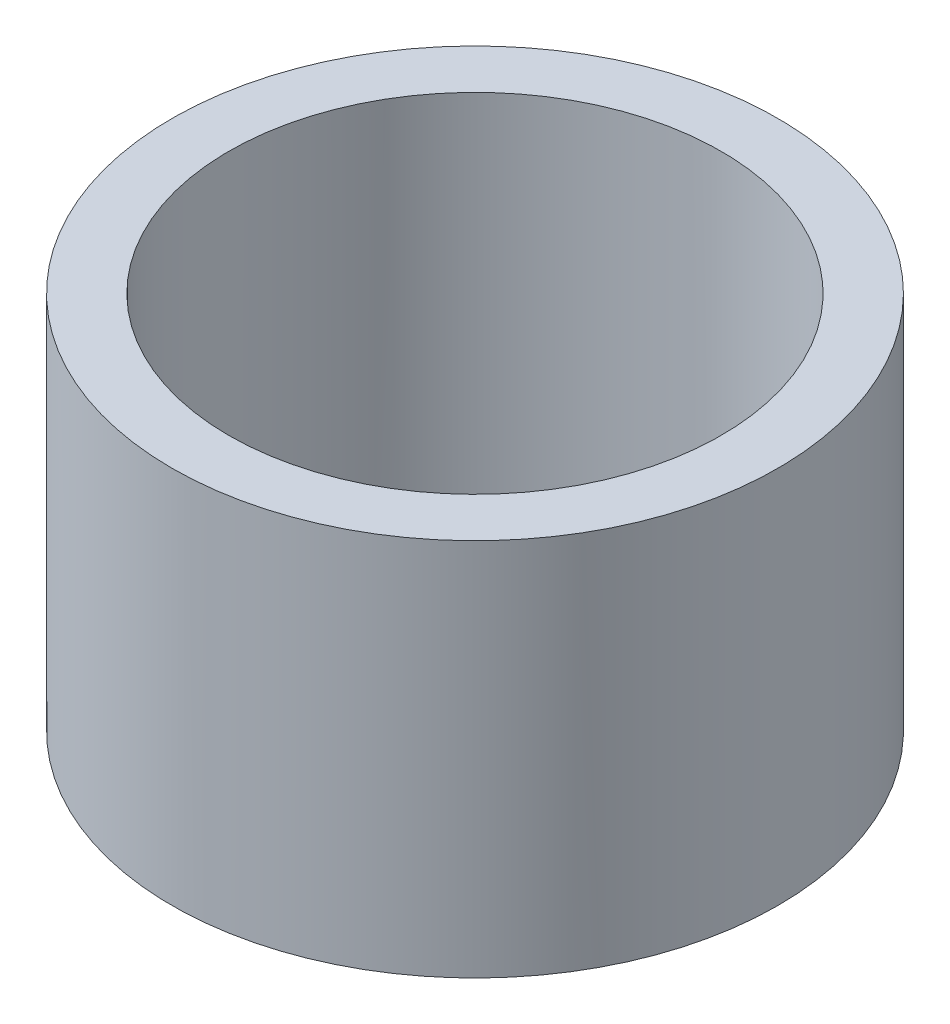
ISO-10303-21;
HEADER;
FILE_DESCRIPTION(('STEP AP214'),'2;1');
FILE_NAME('part.step','',(''),(''),'','','');
FILE_SCHEMA(('AUTOMOTIVE_DESIGN { 1 0 10303 214 1 1 1 1 }'));
ENDSEC;
DATA;
#1=APPLICATION_CONTEXT('core data for automotive mechanical design processes');
#2=APPLICATION_PROTOCOL_DEFINITION('international standard','automotive_design',2000,#1);
#3=PRODUCT_CONTEXT('',#1,'mechanical');
#4=PRODUCT('Part','Part','',(#3));
#5=PRODUCT_RELATED_PRODUCT_CATEGORY('part','',(#4));
#6=PRODUCT_DEFINITION_FORMATION('','',#4);
#7=PRODUCT_DEFINITION_CONTEXT('part definition',#1,'design');
#8=PRODUCT_DEFINITION('design','',#6,#7);
#9=PRODUCT_DEFINITION_SHAPE('','',#8);
#10=(LENGTH_UNIT() NAMED_UNIT(*) SI_UNIT(.MILLI.,.METRE.));
#11=(NAMED_UNIT(*) PLANE_ANGLE_UNIT() SI_UNIT($,.RADIAN.));
#12=(NAMED_UNIT(*) SI_UNIT($,.STERADIAN.) SOLID_ANGLE_UNIT());
#13=UNCERTAINTY_MEASURE_WITH_UNIT(LENGTH_MEASURE(1.E-05),#10,'distance_accuracy_value','');
#14=(GEOMETRIC_REPRESENTATION_CONTEXT(3) GLOBAL_UNCERTAINTY_ASSIGNED_CONTEXT((#13)) GLOBAL_UNIT_ASSIGNED_CONTEXT((#10,
#11,#12)) REPRESENTATION_CONTEXT('',''));
#15=CARTESIAN_POINT('',(0.,0.,0.));
#16=DIRECTION('',(0.,0.,1.));
#17=DIRECTION('',(1.,0.,0.));
#18=AXIS2_PLACEMENT_3D('',#15,#16,#17);
#19=CARTESIAN_POINT('',(0.,25.4,0.));
#20=DIRECTION('',(0.,-1.,0.));
#21=DIRECTION('',(0.,0.,-1.));
#22=AXIS2_PLACEMENT_3D('',#19,#20,#21);
#23=CYLINDRICAL_SURFACE('',#22,20.32);
#24=CARTESIAN_POINT('',(0.,25.4,0.));
#25=DIRECTION('',(0.,1.,0.));
#26=DIRECTION('',(0.,0.,1.));
#27=AXIS2_PLACEMENT_3D('',#24,#25,#26);
#28=CIRCLE('',#27,20.32);
#29=CARTESIAN_POINT('',(0.,25.4,20.32));
#30=VERTEX_POINT('',#29);
#31=EDGE_CURVE('E50',#30,#30,#28,.T.);
#32=ORIENTED_EDGE('',*,*,#31,.F.);
#33=EDGE_LOOP('',(#32));
#34=FACE_BOUND('',#33,.T.);
#35=CARTESIAN_POINT('',(0.,0.,0.));
#36=DIRECTION('',(0.,1.,0.));
#37=DIRECTION('',(0.,0.,1.));
#38=AXIS2_PLACEMENT_3D('',#35,#36,#37);
#39=CIRCLE('',#38,20.32);
#40=CARTESIAN_POINT('',(-6.35,0.,-19.3023288750347));
#41=VERTEX_POINT('',#40);
#42=CARTESIAN_POINT('',(6.35,0.,-19.3023288750347));
#43=VERTEX_POINT('',#42);
#44=EDGE_CURVE('E77',#41,#43,#39,.T.);
#45=ORIENTED_EDGE('',*,*,#44,.T.);
#46=CARTESIAN_POINT('',(6.35,0.,-19.3023288750347));
#47=CARTESIAN_POINT('',(6.35002397968729,0.173900546536237,-19.3023026052748));
#48=CARTESIAN_POINT('',(6.34285745939837,0.347791407351889,-19.3046780771324));
#49=CARTESIAN_POINT('',(6.31432130898476,0.694238182795276,-19.3140405148026));
#50=CARTESIAN_POINT('',(6.29295510194294,0.866794409020381,-19.321026369199));
#51=CARTESIAN_POINT('',(6.23627345209906,1.20888184979501,-19.3393930819205));
#52=CARTESIAN_POINT('',(6.20099558928584,1.37841993836421,-19.3507620980411));
#53=CARTESIAN_POINT('',(6.11681506558896,1.71375416256986,-19.3775368665927));
#54=CARTESIAN_POINT('',(6.06791199970649,1.87955018681791,-19.3929427390154));
#55=CARTESIAN_POINT('',(5.95693487005035,2.20616367591909,-19.427318179355));
#56=CARTESIAN_POINT('',(5.89486961237964,2.36698438745567,-19.4462853636251));
#57=CARTESIAN_POINT('',(5.75801897275823,2.68278665955032,-19.487245013476));
#58=CARTESIAN_POINT('',(5.6832288538056,2.83776601924567,-19.5092386050927));
#59=CARTESIAN_POINT('',(5.52148988817349,3.14088582825984,-19.5556289604368));
#60=CARTESIAN_POINT('',(5.43453973848964,3.28902554241281,-19.58002598162));
#61=CARTESIAN_POINT('',(5.24905112754317,3.57762474813101,-19.6305655238371));
#62=CARTESIAN_POINT('',(5.15050827701985,3.71808130099851,-19.6567087043768));
#63=CARTESIAN_POINT('',(4.93930701617558,3.99461309280614,-19.7108571071541));
#64=CARTESIAN_POINT('',(4.82630883486054,4.13042257472527,-19.7388948318858));
#65=CARTESIAN_POINT('',(4.58939495301406,4.39216636194784,-19.7953197446052));
#66=CARTESIAN_POINT('',(4.46547546562753,4.5180972130995,-19.8237070508483));
#67=CARTESIAN_POINT('',(4.20752328186234,4.7592457647684,-19.880054644743));
#68=CARTESIAN_POINT('',(4.07349048557858,4.87446335942883,-19.9080149281728));
#69=CARTESIAN_POINT('',(3.79613940364797,5.09343137349247,-19.9627578936394));
#70=CARTESIAN_POINT('',(3.65282119532902,5.19718188837279,-19.98954058548));
#71=CARTESIAN_POINT('',(3.35440415033173,5.39473999803851,-20.0418021903898));
#72=CARTESIAN_POINT('',(3.19911074907755,5.48826564508155,-20.0672372281483));
#73=CARTESIAN_POINT('',(2.88082651743706,5.66181789005146,-20.1153953740457));
#74=CARTESIAN_POINT('',(2.71783857662898,5.74184950466528,-20.1381194891036));
#75=CARTESIAN_POINT('',(2.3852081958649,5.8878071385765,-20.1802201802137));
#76=CARTESIAN_POINT('',(2.21556459715685,5.95373068864429,-20.1995961701543));
#77=CARTESIAN_POINT('',(1.87095121318768,6.07084367141059,-20.2344240175959));
#78=CARTESIAN_POINT('',(1.69598379758574,6.12203955638306,-20.2498775931787));
#79=CARTESIAN_POINT('',(1.34737816559998,6.20792308578717,-20.2760101470553));
#80=CARTESIAN_POINT('',(1.17386196494333,6.2430663097077,-20.2868202898883));
#81=CARTESIAN_POINT('',(0.824353467479496,6.29874915267141,-20.3040251693277));
#82=CARTESIAN_POINT('',(0.648362198639289,6.31929466195483,-20.3104216868208));
#83=CARTESIAN_POINT('',(0.295168457705594,6.3456076235268,-20.3186239567043));
#84=CARTESIAN_POINT('',(0.117965965413073,6.35137482875834,-20.3204296323472));
#85=CARTESIAN_POINT('',(-0.236285402126716,6.34807399829559,-20.3193981294802));
#86=CARTESIAN_POINT('',(-0.413334280385156,6.33900626028708,-20.3165610441344));
#87=CARTESIAN_POINT('',(-0.75978800002281,6.30669742812604,-20.306504094143));
#88=CARTESIAN_POINT('',(-0.929244625474909,6.28395996233216,-20.299440004796));
#89=CARTESIAN_POINT('',(-1.26561936287746,6.22493975249883,-20.2812471761283));
#90=CARTESIAN_POINT('',(-1.43253659245661,6.18865240728635,-20.2701170561214));
#91=CARTESIAN_POINT('',(-1.76257398681138,6.10285963922746,-20.2440887043088));
#92=CARTESIAN_POINT('',(-1.92569540930161,6.05335866442966,-20.2291917406088));
#93=CARTESIAN_POINT('',(-2.24718555119149,5.94151792912484,-20.1960066447548));
#94=CARTESIAN_POINT('',(-2.40555245547391,5.87917333500088,-20.1777172361339));
#95=CARTESIAN_POINT('',(-2.71831587591731,5.7413248212806,-20.1379816519314));
#96=CARTESIAN_POINT('',(-2.87264296116886,5.66567350127665,-20.1165005863226));
#97=CARTESIAN_POINT('',(-3.17443617595648,5.5022642633185,-20.0710899599583));
#98=CARTESIAN_POINT('',(-3.32189993003909,5.41450219479905,-20.0471595605026));
#99=CARTESIAN_POINT('',(-3.60903438555263,5.22749712456182,-19.9974624197556));
#100=CARTESIAN_POINT('',(-3.74870488111557,5.12825381976644,-19.9716956299948));
#101=CARTESIAN_POINT('',(-4.01943887365935,4.9189319854874,-19.9189742391221));
#102=CARTESIAN_POINT('',(-4.15050209695761,4.80885311174657,-19.8920196002861));
#103=CARTESIAN_POINT('',(-4.40854929500435,4.57372063973991,-19.8364622306264));
#104=CARTESIAN_POINT('',(-4.53513382481939,4.4482334577556,-19.8078377031017));
#105=CARTESIAN_POINT('',(-4.77729572522413,4.18708100542198,-19.7508308270157));
#106=CARTESIAN_POINT('',(-4.89287658973449,4.05141899044495,-19.722448404204));
#107=CARTESIAN_POINT('',(-5.11239671839688,3.77063355631762,-19.6666885009643));
#108=CARTESIAN_POINT('',(-5.21632807333044,3.62550381372852,-19.6393117116693));
#109=CARTESIAN_POINT('',(-5.41170116004816,3.32683353565406,-19.5863762315009));
#110=CARTESIAN_POINT('',(-5.50314775472133,3.17329630777192,-19.5608168346119));
#111=CARTESIAN_POINT('',(-5.67395546520375,2.85682543940036,-19.5119609638219));
#112=CARTESIAN_POINT('',(-5.75315606984209,2.69380022956033,-19.4886957924558));
#113=CARTESIAN_POINT('',(-5.89743736865098,2.36126381927182,-19.4455214532269));
#114=CARTESIAN_POINT('',(-5.96252387528901,2.19175532273179,-19.4256109046199));
#115=CARTESIAN_POINT('',(-6.07797946340582,1.84758613247907,-19.3897968523509));
#116=CARTESIAN_POINT('',(-6.12836420051083,1.67293113906717,-19.3738890887059));
#117=CARTESIAN_POINT('',(-6.21401299772741,1.31968061392066,-19.3465877305501));
#118=CARTESIAN_POINT('',(-6.24928400555329,1.14108693256996,-19.3351920620326));
#119=CARTESIAN_POINT('',(-6.30117105033198,0.802242417868634,-19.3183418104704));
#120=CARTESIAN_POINT('',(-6.31948027843463,0.642275430680727,-19.3123501985022));
#121=CARTESIAN_POINT('',(-6.34389422810715,0.321543019744989,-19.3043372111138));
#122=CARTESIAN_POINT('',(-6.35001618448883,0.160779046290404,-19.3023102291242));
#123=CARTESIAN_POINT('',(-6.35,0.,-19.3023288750347));
#124=B_SPLINE_CURVE_WITH_KNOTS('',3,(#46,#47,#48,#49,#50,#51,#52,#53,#54,#55,#56,#57,#58,#59,
#60,#61,#62,#63,#64,#65,#66,#67,#68,#69,#70,#71,#72,#73,#74,#75,#76,#77,#78,#79,#80,#81,#82,#83,
#84,#85,#86,#87,#88,#89,#90,#91,#92,#93,#94,#95,#96,#97,#98,#99,#100,#101,#102,#103,#104,#105,
#106,#107,#108,#109,#110,#111,#112,#113,#114,#115,#116,#117,#118,#119,#120,#121,#122,#123),
.UNSPECIFIED.,.F.,.F.,(4,2,2,2,2,2,2,2,2,2,2,2,2,2,2,2,2,2,2,2,2,2,2,2,2,2,2,2,2,2,2,2,2,2,2,2,
2,2,4),(0.,0.52152285809271,1.04292003955919,1.56291829811894,2.08293201488127,2.60259891035146,
3.12245968383345,3.64237620557988,4.16249021699629,4.69852656634943,5.23474951782096,
5.77097776710489,6.30720155131295,6.85569927900955,7.40399263949662,7.95238188535176,
8.50053051158648,9.03197276120966,9.56320044964398,10.0944370188448,10.6256629281034,
11.1384231974012,11.651357744813,12.1641198424934,12.677075268718,13.196118745654,
13.7153405517047,14.2345760671166,14.7538280845028,15.2947825374934,15.8355646478998,
16.3767117164051,16.9176473998321,17.4651619930541,18.0124506788167,18.5591544227058,
19.105606578992,19.5884706421377,20.0706513694219),.UNSPECIFIED.);
#125=EDGE_CURVE('E62',#43,#41,#124,.T.);
#126=ORIENTED_EDGE('',*,*,#125,.T.);
#127=EDGE_LOOP('',(#45,#126));
#128=FACE_BOUND('',#127,.T.);
#129=ADVANCED_FACE('F37',(#34,#128),#23,.T.);
#130=CARTESIAN_POINT('',(0.,25.4,0.));
#131=DIRECTION('',(0.,1.,0.));
#132=DIRECTION('',(0.,0.,1.));
#133=AXIS2_PLACEMENT_3D('',#130,#131,#132);
#134=PLANE('',#133);
#135=CARTESIAN_POINT('',(0.,25.4,0.));
#136=DIRECTION('',(0.,1.,0.));
#137=DIRECTION('',(0.,0.,1.));
#138=AXIS2_PLACEMENT_3D('',#135,#136,#137);
#139=CIRCLE('',#138,16.51);
#140=CARTESIAN_POINT('',(0.,25.4,16.51));
#141=VERTEX_POINT('',#140);
#142=EDGE_CURVE('E81',#141,#141,#139,.T.);
#143=ORIENTED_EDGE('',*,*,#142,.F.);
#144=EDGE_LOOP('',(#143));
#145=FACE_BOUND('',#144,.T.);
#146=ORIENTED_EDGE('',*,*,#31,.T.);
#147=EDGE_LOOP('',(#146));
#148=FACE_BOUND('',#147,.T.);
#149=ADVANCED_FACE('F93',(#145,#148),#134,.T.);
#150=CARTESIAN_POINT('',(0.,0.,0.));
#151=DIRECTION('',(0.,1.,0.));
#152=DIRECTION('',(0.,0.,1.));
#153=AXIS2_PLACEMENT_3D('',#150,#151,#152);
#154=PLANE('',#153);
#155=ORIENTED_EDGE('',*,*,#44,.F.);
#156=DIRECTION('',(0.,0.,1.));
#157=VECTOR('',#156,1.);
#158=CARTESIAN_POINT('',(-6.35,0.,-20.32));
#159=LINE('',#158,#157);
#160=CARTESIAN_POINT('',(-6.35,0.,-15.24));
#161=VERTEX_POINT('',#160);
#162=EDGE_CURVE('E69',#41,#161,#159,.T.);
#163=ORIENTED_EDGE('',*,*,#162,.T.);
#164=CARTESIAN_POINT('',(0.,0.,0.));
#165=DIRECTION('',(0.,1.,0.));
#166=DIRECTION('',(0.,0.,1.));
#167=AXIS2_PLACEMENT_3D('',#164,#165,#166);
#168=CIRCLE('',#167,16.51);
#169=CARTESIAN_POINT('',(6.35,0.,-15.24));
#170=VERTEX_POINT('',#169);
#171=EDGE_CURVE('E76',#161,#170,#168,.T.);
#172=ORIENTED_EDGE('',*,*,#171,.T.);
#173=DIRECTION('',(0.,0.,1.));
#174=VECTOR('',#173,1.);
#175=CARTESIAN_POINT('',(6.35,0.,-20.32));
#176=LINE('',#175,#174);
#177=EDGE_CURVE('E57',#170,#43,#176,.F.);
#178=ORIENTED_EDGE('',*,*,#177,.T.);
#179=EDGE_LOOP('',(#155,#163,#172,#178));
#180=FACE_BOUND('',#179,.T.);
#181=ADVANCED_FACE('F75',(#180),#154,.F.);
#182=CARTESIAN_POINT('',(0.,0.,0.));
#183=DIRECTION('',(0.,1.,0.));
#184=DIRECTION('',(0.,0.,1.));
#185=AXIS2_PLACEMENT_3D('',#182,#183,#184);
#186=CYLINDRICAL_SURFACE('',#185,16.51);
#187=ORIENTED_EDGE('',*,*,#171,.F.);
#188=CARTESIAN_POINT('',(-6.35,0.,-15.24));
#189=CARTESIAN_POINT('',(-6.3500264200606,0.171429478455172,-15.2399658645172));
#190=CARTESIAN_POINT('',(-6.34305918174074,0.342845260196501,-15.2428913901655));
#191=CARTESIAN_POINT('',(-6.31533553854652,0.684307685190393,-15.2544108343446));
#192=CARTESIAN_POINT('',(-6.29458399538493,0.854354789779797,-15.2630027543352));
#193=CARTESIAN_POINT('',(-6.23959124193809,1.19123835679288,-15.2855627035051));
#194=CARTESIAN_POINT('',(-6.2054000691196,1.35808434795935,-15.2995107866087));
#195=CARTESIAN_POINT('',(-6.12387827416366,1.68804360956788,-15.3323238885452));
#196=CARTESIAN_POINT('',(-6.07654693399594,1.85115667550089,-15.35118917607));
#197=CARTESIAN_POINT('',(-5.96924934276245,2.1723731293729,-15.393228074582));
#198=CARTESIAN_POINT('',(-5.90929827222839,2.33048227610165,-15.4163965053254));
#199=CARTESIAN_POINT('',(-5.77720906331345,2.64099097650934,-15.4663809976555));
#200=CARTESIAN_POINT('',(-5.70506636755832,2.79338836894263,-15.4931984225464));
#201=CARTESIAN_POINT('',(-5.54912047389205,3.09161618029051,-15.5497344050018));
#202=CARTESIAN_POINT('',(-5.46531207934649,3.23744363400852,-15.5794542537176));
#203=CARTESIAN_POINT('',(-5.28659697345154,3.52173173918488,-15.6410014079344));
#204=CARTESIAN_POINT('',(-5.19168623802523,3.66018969292425,-15.6728294757413));
#205=CARTESIAN_POINT('',(-4.98664114239979,3.93531648950877,-15.7393031498966));
#206=CARTESIAN_POINT('',(-4.87599980102501,4.0715927275956,-15.7740108400282));
#207=CARTESIAN_POINT('',(-4.64388869780723,4.33446003038191,-15.8438974236683));
#208=CARTESIAN_POINT('',(-4.52241865184318,4.46105084079535,-15.8790763295198));
#209=CARTESIAN_POINT('',(-4.26930774618774,4.70385761184949,-15.9489922097726));
#210=CARTESIAN_POINT('',(-4.13766316056563,4.82006973789916,-15.9837290168013));
#211=CARTESIAN_POINT('',(-3.8650353787881,5.04131029188048,-16.051832724685));
#212=CARTESIAN_POINT('',(-3.72405543477438,5.1463425816085,-16.0852000961144));
#213=CARTESIAN_POINT('',(-3.42819742819615,5.34819505077258,-16.1508931556145));
#214=CARTESIAN_POINT('',(-3.2729996276244,5.44457433406765,-16.1831361002667));
#215=CARTESIAN_POINT('',(-2.95443319574692,5.62380768121419,-16.2443133899088));
#216=CARTESIAN_POINT('',(-2.79106767649546,5.70666684594562,-16.2732489814596));
#217=CARTESIAN_POINT('',(-2.45723093046305,5.85816612890225,-16.3269927629283));
#218=CARTESIAN_POINT('',(-2.28676043571801,5.92680770765695,-16.3518013767465));
#219=CARTESIAN_POINT('',(-1.93994032881047,6.04921002144545,-16.3965634778279));
#220=CARTESIAN_POINT('',(-1.76359106204049,6.10297162899427,-16.4165172497555));
#221=CARTESIAN_POINT('',(-1.41444556610189,6.19296885018401,-16.4501915667796));
#222=CARTESIAN_POINT('',(-1.24184803982037,6.22988578962198,-16.4641527334564));
#223=CARTESIAN_POINT('',(-0.893839586059802,6.28925309310989,-16.4867082320125));
#224=CARTESIAN_POINT('',(-0.718428811816225,6.3117042423761,-16.495302855192));
#225=CARTESIAN_POINT('',(-0.366207027739135,6.34189465667637,-16.5068783621681));
#226=CARTESIAN_POINT('',(-0.189396396262524,6.34963776930652,-16.5098607141229));
#227=CARTESIAN_POINT('',(0.164255780048473,6.35033734679469,-16.5101297151558));
#228=CARTESIAN_POINT('',(0.34109732371007,6.34329428569544,-16.5074165468314));
#229=CARTESIAN_POINT('',(0.68418509324374,6.31525542351931,-16.4966631976185));
#230=CARTESIAN_POINT('',(0.850502097177451,6.29500795342686,-16.4889087878803));
#231=CARTESIAN_POINT('',(1.18078259627037,6.24149405058522,-16.4685529240994));
#232=CARTESIAN_POINT('',(1.34474530211871,6.20822335260984,-16.4559498821084));
#233=CARTESIAN_POINT('',(1.66909055616201,6.12898838355482,-16.4262214791322));
#234=CARTESIAN_POINT('',(1.82947430313084,6.08302843387514,-16.4090976578119));
#235=CARTESIAN_POINT('',(2.14574715201272,5.97879623686832,-16.3707439279688));
#236=CARTESIAN_POINT('',(2.3016345235835,5.92051931958511,-16.349512462299));
#237=CARTESIAN_POINT('',(2.61011305650401,5.79121588256687,-16.3031312397448));
#238=CARTESIAN_POINT('',(2.762624475423,5.72001792084202,-16.2779294823296));
#239=CARTESIAN_POINT('',(3.06114480260512,5.56597833119451,-16.2244413758424));
#240=CARTESIAN_POINT('',(3.20715147370724,5.48313273742641,-16.1961539768937));
#241=CARTESIAN_POINT('',(3.49181942413506,5.30638944432763,-16.1371754052322));
#242=CARTESIAN_POINT('',(3.63047998637968,5.21249066892649,-16.1064839985774));
#243=CARTESIAN_POINT('',(3.8997175382188,5.01424513683461,-16.0434230812546));
#244=CARTESIAN_POINT('',(4.03029413346386,4.9098978710979,-16.0110534888632));
#245=CARTESIAN_POINT('',(4.29044217939302,4.68465537432551,-15.9433798694762));
#246=CARTESIAN_POINT('',(4.41946004323761,4.56313757043563,-15.9080176759994));
#247=CARTESIAN_POINT('',(4.66684327177551,4.30980399757067,-15.8372101868995));
#248=CARTESIAN_POINT('',(4.78521179121242,4.17799130009673,-15.8017649191));
#249=CARTESIAN_POINT('',(5.0107168003728,3.90469284845684,-15.7317122605765));
#250=CARTESIAN_POINT('',(5.11784447752104,3.76319964643857,-15.6971055433638));
#251=CARTESIAN_POINT('',(5.32002501208619,3.47150010702184,-15.629740459995));
#252=CARTESIAN_POINT('',(5.41508255603137,3.32129718458947,-15.5969813792112));
#253=CARTESIAN_POINT('',(5.5947487935139,3.00907673393671,-15.533454204644));
#254=CARTESIAN_POINT('',(5.67903015803151,2.84685585534548,-15.502757960556));
#255=CARTESIAN_POINT('',(5.83348218987911,2.51523883296252,-15.4453027128148));
#256=CARTESIAN_POINT('',(5.90365889249164,2.34584579581049,-15.4185420264856));
#257=CARTESIAN_POINT('',(6.02920126437891,2.00120476049562,-15.3698851573881));
#258=CARTESIAN_POINT('',(6.08458461975016,1.82596403816078,-15.3479831711906));
#259=CARTESIAN_POINT('',(6.18004254776583,1.47084054243334,-15.3097943161962));
#260=CARTESIAN_POINT('',(6.22012401172004,1.29095989771947,-15.2935049200545));
#261=CARTESIAN_POINT('',(6.28475788677523,0.926680700909544,-15.2670632979711));
#262=CARTESIAN_POINT('',(6.30920054434052,0.74225945177386,-15.2569544688963));
#263=CARTESIAN_POINT('',(6.34183313714253,0.371897901038669,-15.2434020407328));
#264=CARTESIAN_POINT('',(6.35003637966469,0.185958968672506,-15.2399529843927));
#265=CARTESIAN_POINT('',(6.35,0.,-15.24));
#266=B_SPLINE_CURVE_WITH_KNOTS('',3,(#188,#189,#190,#191,#192,#193,#194,#195,#196,#197,#198,
#199,#200,#201,#202,#203,#204,#205,#206,#207,#208,#209,#210,#211,#212,#213,#214,#215,#216,#217,
#218,#219,#220,#221,#222,#223,#224,#225,#226,#227,#228,#229,#230,#231,#232,#233,#234,#235,#236,
#237,#238,#239,#240,#241,#242,#243,#244,#245,#246,#247,#248,#249,#250,#251,#252,#253,#254,#255,
#256,#257,#258,#259,#260,#261,#262,#263,#264,#265),.UNSPECIFIED.,.F.,.F.,(4,2,2,2,2,2,2,2,2,2,2,
2,2,2,2,2,2,2,2,2,2,2,2,2,2,2,2,2,2,2,2,2,2,2,2,2,2,2,4),(0.,0.514100593241637,1.0280199598434,
1.54004379120992,2.05209560707533,2.56353494973238,3.07516589910266,3.58702549476975,
4.09907119372019,4.63527499129455,5.17149286180351,5.70790803502365,6.24413731151131,
6.79998029703611,7.35561308639526,7.91118876894309,8.46673186736419,8.99720879075887,
9.52765691695621,10.0579662597516,10.5882586011615,11.0908405567147,11.5935872503585,
12.0961629413728,12.5989295259877,13.1089328622349,13.6191102694691,14.12933738561,
14.6395893719032,15.181158922784,15.7225675080964,16.2643974235592,16.8060163126105,
17.361413618795,17.9165727661697,18.4710651951458,19.0253076093111,19.5833982382926,
20.1410313538397),.UNSPECIFIED.);
#267=EDGE_CURVE('E11',#161,#170,#266,.T.);
#268=ORIENTED_EDGE('',*,*,#267,.T.);
#269=EDGE_LOOP('',(#187,#268));
#270=FACE_BOUND('',#269,.T.);
#271=ORIENTED_EDGE('',*,*,#142,.T.);
#272=EDGE_LOOP('',(#271));
#273=FACE_BOUND('',#272,.T.);
#274=ADVANCED_FACE('F79',(#270,#273),#186,.F.);
#275=CARTESIAN_POINT('',(0.,0.,-20.32));
#276=DIRECTION('',(0.,0.,1.));
#277=DIRECTION('',(1.,0.,0.));
#278=AXIS2_PLACEMENT_3D('',#275,#276,#277);
#279=CYLINDRICAL_SURFACE('',#278,6.35);
#280=ORIENTED_EDGE('',*,*,#177,.F.);
#281=ORIENTED_EDGE('',*,*,#267,.F.);
#282=ORIENTED_EDGE('',*,*,#162,.F.);
#283=ORIENTED_EDGE('',*,*,#125,.F.);
#284=EDGE_LOOP('',(#280,#281,#282,#283));
#285=FACE_BOUND('',#284,.T.);
#286=ADVANCED_FACE('F68',(#285),#279,.F.);
#287=CLOSED_SHELL('',(#129,#149,#181,#274,#286));
#288=MANIFOLD_SOLID_BREP('B2',#287);
#289=ADVANCED_BREP_SHAPE_REPRESENTATION('',(#18,#288),#14);
#290=SHAPE_DEFINITION_REPRESENTATION(#9,#289);
ENDSEC;
END-ISO-10303-21;
